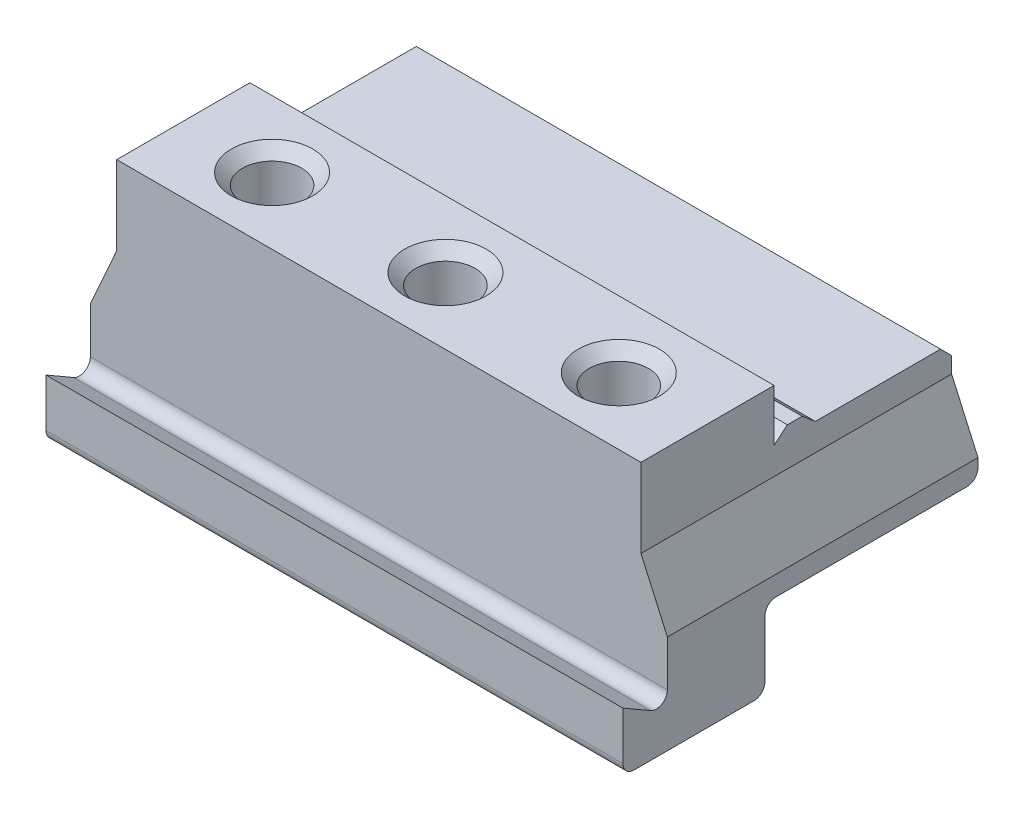
ISO-10303-21;
HEADER;
FILE_DESCRIPTION(('STEP AP214'),'2;1');
FILE_NAME('part.step','',(''),(''),'','','');
FILE_SCHEMA(('AUTOMOTIVE_DESIGN { 1 0 10303 214 1 1 1 1 }'));
ENDSEC;
DATA;
#1=APPLICATION_CONTEXT('core data for automotive mechanical design processes');
#2=APPLICATION_PROTOCOL_DEFINITION('international standard','automotive_design',2000,#1);
#3=PRODUCT_CONTEXT('',#1,'mechanical');
#4=PRODUCT('Part','Part','',(#3));
#5=PRODUCT_RELATED_PRODUCT_CATEGORY('part','',(#4));
#6=PRODUCT_DEFINITION_FORMATION('','',#4);
#7=PRODUCT_DEFINITION_CONTEXT('part definition',#1,'design');
#8=PRODUCT_DEFINITION('design','',#6,#7);
#9=PRODUCT_DEFINITION_SHAPE('','',#8);
#10=(LENGTH_UNIT() NAMED_UNIT(*) SI_UNIT(.MILLI.,.METRE.));
#11=(NAMED_UNIT(*) PLANE_ANGLE_UNIT() SI_UNIT($,.RADIAN.));
#12=(NAMED_UNIT(*) SI_UNIT($,.STERADIAN.) SOLID_ANGLE_UNIT());
#13=UNCERTAINTY_MEASURE_WITH_UNIT(LENGTH_MEASURE(1.E-05),#10,'distance_accuracy_value','');
#14=(GEOMETRIC_REPRESENTATION_CONTEXT(3) GLOBAL_UNCERTAINTY_ASSIGNED_CONTEXT((#13)) GLOBAL_UNIT_ASSIGNED_CONTEXT((#10,
#11,#12)) REPRESENTATION_CONTEXT('',''));
#15=CARTESIAN_POINT('',(0.,0.,0.));
#16=DIRECTION('',(0.,0.,1.));
#17=DIRECTION('',(1.,0.,0.));
#18=AXIS2_PLACEMENT_3D('',#15,#16,#17);
#19=CARTESIAN_POINT('',(78.,32.,0.));
#20=DIRECTION('',(0.,-1.,0.));
#21=DIRECTION('',(0.,0.,-1.));
#22=AXIS2_PLACEMENT_3D('',#19,#20,#21);
#23=PLANE('',#22);
#24=CARTESIAN_POINT('',(62.4381705175318,32.,-15.));
#25=DIRECTION('',(0.,-1.,0.));
#26=DIRECTION('',(0.,0.,-1.));
#27=AXIS2_PLACEMENT_3D('',#24,#25,#26);
#28=CIRCLE('',#27,5.50000000000002);
#29=CARTESIAN_POINT('',(62.4381705175318,32.,-20.5));
#30=VERTEX_POINT('',#29);
#31=EDGE_CURVE('E271',#30,#30,#28,.T.);
#32=ORIENTED_EDGE('',*,*,#31,.T.);
#33=EDGE_LOOP('',(#32));
#34=FACE_BOUND('',#33,.T.);
#35=CARTESIAN_POINT('',(15.5618294824682,32.,-15.));
#36=DIRECTION('',(0.,-1.,0.));
#37=DIRECTION('',(0.,0.,-1.));
#38=AXIS2_PLACEMENT_3D('',#35,#36,#37);
#39=CIRCLE('',#38,5.50000000000002);
#40=CARTESIAN_POINT('',(15.5618294824682,32.,-20.5));
#41=VERTEX_POINT('',#40);
#42=EDGE_CURVE('E268',#41,#41,#39,.T.);
#43=ORIENTED_EDGE('',*,*,#42,.T.);
#44=EDGE_LOOP('',(#43));
#45=FACE_BOUND('',#44,.T.);
#46=CARTESIAN_POINT('',(39.,32.,-15.));
#47=DIRECTION('',(0.,-1.,0.));
#48=DIRECTION('',(0.,0.,-1.));
#49=AXIS2_PLACEMENT_3D('',#46,#47,#48);
#50=CIRCLE('',#49,5.50000000000002);
#51=CARTESIAN_POINT('',(39.,32.,-20.5));
#52=VERTEX_POINT('',#51);
#53=EDGE_CURVE('E270',#52,#52,#50,.T.);
#54=ORIENTED_EDGE('',*,*,#53,.T.);
#55=EDGE_LOOP('',(#54));
#56=FACE_BOUND('',#55,.T.);
#57=DIRECTION('',(0.,0.,1.));
#58=VECTOR('',#57,1.);
#59=CARTESIAN_POINT('',(74.4381705175318,32.,-48.5));
#60=LINE('',#59,#58);
#61=CARTESIAN_POINT('',(74.4381705175318,32.,-24.));
#62=VERTEX_POINT('',#61);
#63=CARTESIAN_POINT('',(74.4381705175318,32.,-6.));
#64=VERTEX_POINT('',#63);
#65=EDGE_CURVE('E197',#62,#64,#60,.T.);
#66=ORIENTED_EDGE('',*,*,#65,.F.);
#67=DIRECTION('',(-1.,0.,0.));
#68=VECTOR('',#67,1.);
#69=CARTESIAN_POINT('',(78.,32.,-24.));
#70=LINE('',#69,#68);
#71=CARTESIAN_POINT('',(3.56182948246823,32.,-24.));
#72=VERTEX_POINT('',#71);
#73=EDGE_CURVE('E219',#62,#72,#70,.T.);
#74=ORIENTED_EDGE('',*,*,#73,.T.);
#75=DIRECTION('',(0.,0.,1.));
#76=VECTOR('',#75,1.);
#77=CARTESIAN_POINT('',(3.56182948246823,32.,-48.5));
#78=LINE('',#77,#76);
#79=CARTESIAN_POINT('',(3.56182948246823,32.,-6.));
#80=VERTEX_POINT('',#79);
#81=EDGE_CURVE('E70',#72,#80,#78,.T.);
#82=ORIENTED_EDGE('',*,*,#81,.T.);
#83=DIRECTION('',(-1.,0.,0.));
#84=VECTOR('',#83,1.);
#85=CARTESIAN_POINT('',(78.,32.,-6.));
#86=LINE('',#85,#84);
#87=EDGE_CURVE('E216',#64,#80,#86,.T.);
#88=ORIENTED_EDGE('',*,*,#87,.F.);
#89=EDGE_LOOP('',(#66,#74,#82,#88));
#90=FACE_BOUND('',#89,.T.);
#91=ADVANCED_FACE('F43',(#34,#45,#56,#90),#23,.F.);
#92=CARTESIAN_POINT('',(78.,0.,-6.));
#93=DIRECTION('',(0.,0.,-1.));
#94=DIRECTION('',(-1.,0.,0.));
#95=AXIS2_PLACEMENT_3D('',#92,#93,#94);
#96=PLANE('',#95);
#97=DIRECTION('',(0.,-1.,0.));
#98=VECTOR('',#97,1.);
#99=CARTESIAN_POINT('',(74.4381705175318,21.33,-6.));
#100=LINE('',#99,#98);
#101=CARTESIAN_POINT('',(74.4381705175318,21.33,-6.));
#102=VERTEX_POINT('',#101);
#103=EDGE_CURVE('E205',#64,#102,#100,.T.);
#104=ORIENTED_EDGE('',*,*,#103,.F.);
#105=ORIENTED_EDGE('',*,*,#87,.T.);
#106=DIRECTION('',(0.,1.,0.));
#107=VECTOR('',#106,1.);
#108=CARTESIAN_POINT('',(3.56182948246823,21.33,-6.));
#109=LINE('',#108,#107);
#110=CARTESIAN_POINT('',(3.56182948246823,21.33,-6.));
#111=VERTEX_POINT('',#110);
#112=EDGE_CURVE('E483',#111,#80,#109,.T.);
#113=ORIENTED_EDGE('',*,*,#112,.F.);
#114=DIRECTION('',(0.406736643075796,0.913545457642603,0.));
#115=VECTOR('',#114,1.);
#116=CARTESIAN_POINT('',(0.,13.33,-6.));
#117=LINE('',#116,#115);
#118=CARTESIAN_POINT('',(0.,13.33,-6.));
#119=VERTEX_POINT('',#118);
#120=EDGE_CURVE('E217',#119,#111,#117,.T.);
#121=ORIENTED_EDGE('',*,*,#120,.F.);
#122=DIRECTION('',(0.,-1.,0.));
#123=VECTOR('',#122,1.);
#124=CARTESIAN_POINT('',(0.,0.,-6.));
#125=LINE('',#124,#123);
#126=CARTESIAN_POINT('',(0.,7.13397459621554,-6.));
#127=VERTEX_POINT('',#126);
#128=EDGE_CURVE('E379',#119,#127,#125,.T.);
#129=ORIENTED_EDGE('',*,*,#128,.T.);
#130=DIRECTION('',(-1.,0.,0.));
#131=VECTOR('',#130,1.);
#132=CARTESIAN_POINT('',(78.,7.13397459621554,-6.));
#133=LINE('',#132,#131);
#134=CARTESIAN_POINT('',(78.,7.13397459621554,-6.));
#135=VERTEX_POINT('',#134);
#136=EDGE_CURVE('E222',#135,#127,#133,.T.);
#137=ORIENTED_EDGE('',*,*,#136,.F.);
#138=DIRECTION('',(0.,-1.,0.));
#139=VECTOR('',#138,1.);
#140=CARTESIAN_POINT('',(78.,0.,-6.));
#141=LINE('',#140,#139);
#142=CARTESIAN_POINT('',(78.,13.33,-6.));
#143=VERTEX_POINT('',#142);
#144=EDGE_CURVE('E467',#143,#135,#141,.T.);
#145=ORIENTED_EDGE('',*,*,#144,.F.);
#146=DIRECTION('',(0.406736643075796,-0.913545457642603,0.));
#147=VECTOR('',#146,1.);
#148=CARTESIAN_POINT('',(78.,13.33,-6.));
#149=LINE('',#148,#147);
#150=EDGE_CURVE('E208',#102,#143,#149,.T.);
#151=ORIENTED_EDGE('',*,*,#150,.F.);
#152=EDGE_LOOP('',(#104,#105,#113,#121,#129,#137,#145,#151));
#153=FACE_BOUND('',#152,.T.);
#154=ADVANCED_FACE('F211',(#153),#96,.F.);
#155=CARTESIAN_POINT('',(78.,0.,0.));
#156=DIRECTION('',(1.,0.,0.));
#157=DIRECTION('',(0.,0.,-1.));
#158=AXIS2_PLACEMENT_3D('',#155,#156,#157);
#159=PLANE('',#158);
#160=DIRECTION('',(0.,1.,0.));
#161=VECTOR('',#160,1.);
#162=CARTESIAN_POINT('',(78.,0.,-48.));
#163=LINE('',#162,#161);
#164=CARTESIAN_POINT('',(78.,12.17,-48.));
#165=VERTEX_POINT('',#164);
#166=CARTESIAN_POINT('',(78.,13.33,-48.));
#167=VERTEX_POINT('',#166);
#168=EDGE_CURVE('E462',#165,#167,#163,.T.);
#169=ORIENTED_EDGE('',*,*,#168,.T.);
#170=DIRECTION('',(0.,0.,1.));
#171=VECTOR('',#170,1.);
#172=CARTESIAN_POINT('',(78.,13.33,-48.5));
#173=LINE('',#172,#171);
#174=EDGE_CURVE('E257',#167,#143,#173,.T.);
#175=ORIENTED_EDGE('',*,*,#174,.T.);
#176=ORIENTED_EDGE('',*,*,#144,.T.);
#177=CARTESIAN_POINT('',(78.,7.13397459621554,-4.5));
#178=DIRECTION('',(1.,0.,0.));
#179=DIRECTION('',(0.,0.,-1.));
#180=AXIS2_PLACEMENT_3D('',#177,#178,#179);
#181=CIRCLE('',#180,1.5);
#182=CARTESIAN_POINT('',(78.,5.83493649053889,-3.74999999999999));
#183=VERTEX_POINT('',#182);
#184=EDGE_CURVE('E444',#135,#183,#181,.F.);
#185=ORIENTED_EDGE('',*,*,#184,.T.);
#186=DIRECTION('',(0.,0.500000000000004,0.866025403784436));
#187=VECTOR('',#186,1.);
#188=CARTESIAN_POINT('',(78.,5.99999999999997,-3.46410161513777));
#189=LINE('',#188,#187);
#190=CARTESIAN_POINT('',(78.,8.,0.));
#191=VERTEX_POINT('',#190);
#192=EDGE_CURVE('E425',#183,#191,#189,.T.);
#193=ORIENTED_EDGE('',*,*,#192,.T.);
#194=DIRECTION('',(0.,-1.,0.));
#195=VECTOR('',#194,1.);
#196=CARTESIAN_POINT('',(78.,0.,0.));
#197=LINE('',#196,#195);
#198=CARTESIAN_POINT('',(78.,1.50000000000001,0.));
#199=VERTEX_POINT('',#198);
#200=EDGE_CURVE('E438',#191,#199,#197,.T.);
#201=ORIENTED_EDGE('',*,*,#200,.T.);
#202=CARTESIAN_POINT('',(78.,1.5,-1.5));
#203=DIRECTION('',(1.,0.,0.));
#204=DIRECTION('',(0.,0.,-1.));
#205=AXIS2_PLACEMENT_3D('',#202,#203,#204);
#206=CIRCLE('',#205,1.5);
#207=CARTESIAN_POINT('',(78.,0.,-1.50000000000001));
#208=VERTEX_POINT('',#207);
#209=EDGE_CURVE('E441',#208,#199,#206,.F.);
#210=ORIENTED_EDGE('',*,*,#209,.F.);
#211=DIRECTION('',(0.,0.,-1.));
#212=VECTOR('',#211,1.);
#213=CARTESIAN_POINT('',(78.,0.,0.));
#214=LINE('',#213,#212);
#215=CARTESIAN_POINT('',(78.,0.,-17.7));
#216=VERTEX_POINT('',#215);
#217=EDGE_CURVE('E442',#208,#216,#214,.T.);
#218=ORIENTED_EDGE('',*,*,#217,.T.);
#219=CARTESIAN_POINT('',(78.,1.5,-17.7));
#220=DIRECTION('',(1.,0.,0.));
#221=DIRECTION('',(0.,0.,-1.));
#222=AXIS2_PLACEMENT_3D('',#219,#220,#221);
#223=CIRCLE('',#222,1.5);
#224=CARTESIAN_POINT('',(78.,1.50000000000001,-19.2));
#225=VERTEX_POINT('',#224);
#226=EDGE_CURVE('E448',#216,#225,#223,.T.);
#227=ORIENTED_EDGE('',*,*,#226,.T.);
#228=DIRECTION('',(0.,1.,0.));
#229=VECTOR('',#228,1.);
#230=CARTESIAN_POINT('',(78.,0.,-19.2));
#231=LINE('',#230,#229);
#232=CARTESIAN_POINT('',(78.,9.16999999999999,-19.2));
#233=VERTEX_POINT('',#232);
#234=EDGE_CURVE('E452',#225,#233,#231,.T.);
#235=ORIENTED_EDGE('',*,*,#234,.T.);
#236=CARTESIAN_POINT('',(78.,9.17,-20.7));
#237=DIRECTION('',(1.,0.,0.));
#238=DIRECTION('',(0.,0.,-1.));
#239=AXIS2_PLACEMENT_3D('',#236,#237,#238);
#240=CIRCLE('',#239,1.5);
#241=CARTESIAN_POINT('',(78.,10.67,-20.7));
#242=VERTEX_POINT('',#241);
#243=EDGE_CURVE('E374',#233,#242,#240,.F.);
#244=ORIENTED_EDGE('',*,*,#243,.T.);
#245=DIRECTION('',(0.,0.,-1.));
#246=VECTOR('',#245,1.);
#247=CARTESIAN_POINT('',(78.,10.67,0.));
#248=LINE('',#247,#246);
#249=CARTESIAN_POINT('',(78.,10.67,-46.5));
#250=VERTEX_POINT('',#249);
#251=EDGE_CURVE('E398',#242,#250,#248,.T.);
#252=ORIENTED_EDGE('',*,*,#251,.T.);
#253=CARTESIAN_POINT('',(78.,12.17,-46.5));
#254=DIRECTION('',(1.,0.,0.));
#255=DIRECTION('',(0.,0.,-1.));
#256=AXIS2_PLACEMENT_3D('',#253,#254,#255);
#257=CIRCLE('',#256,1.5);
#258=EDGE_CURVE('E458',#250,#165,#257,.T.);
#259=ORIENTED_EDGE('',*,*,#258,.T.);
#260=EDGE_LOOP('',(#169,#175,#176,#185,#193,#201,#210,#218,#227,#235,#244,#252,#259));
#261=FACE_BOUND('',#260,.T.);
#262=ADVANCED_FACE('F303',(#261),#159,.T.);
#263=CARTESIAN_POINT('',(0.,0.,0.));
#264=DIRECTION('',(1.,0.,0.));
#265=DIRECTION('',(0.,0.,-1.));
#266=AXIS2_PLACEMENT_3D('',#263,#264,#265);
#267=PLANE('',#266);
#268=DIRECTION('',(0.,0.,1.));
#269=VECTOR('',#268,1.);
#270=CARTESIAN_POINT('',(0.,13.33,-48.5));
#271=LINE('',#270,#269);
#272=CARTESIAN_POINT('',(0.,13.33,-48.));
#273=VERTEX_POINT('',#272);
#274=EDGE_CURVE('E254',#273,#119,#271,.T.);
#275=ORIENTED_EDGE('',*,*,#274,.F.);
#276=DIRECTION('',(0.,1.,0.));
#277=VECTOR('',#276,1.);
#278=CARTESIAN_POINT('',(0.,0.,-48.));
#279=LINE('',#278,#277);
#280=CARTESIAN_POINT('',(0.,12.17,-48.));
#281=VERTEX_POINT('',#280);
#282=EDGE_CURVE('E367',#281,#273,#279,.T.);
#283=ORIENTED_EDGE('',*,*,#282,.F.);
#284=CARTESIAN_POINT('',(0.,12.17,-46.5));
#285=DIRECTION('',(1.,0.,0.));
#286=DIRECTION('',(0.,0.,-1.));
#287=AXIS2_PLACEMENT_3D('',#284,#285,#286);
#288=CIRCLE('',#287,1.5);
#289=CARTESIAN_POINT('',(0.,10.67,-46.5));
#290=VERTEX_POINT('',#289);
#291=EDGE_CURVE('E366',#290,#281,#288,.T.);
#292=ORIENTED_EDGE('',*,*,#291,.F.);
#293=DIRECTION('',(0.,0.,-1.));
#294=VECTOR('',#293,1.);
#295=CARTESIAN_POINT('',(0.,10.67,0.));
#296=LINE('',#295,#294);
#297=CARTESIAN_POINT('',(0.,10.67,-20.7));
#298=VERTEX_POINT('',#297);
#299=EDGE_CURVE('E363',#298,#290,#296,.T.);
#300=ORIENTED_EDGE('',*,*,#299,.F.);
#301=CARTESIAN_POINT('',(0.,9.17,-20.7));
#302=DIRECTION('',(1.,0.,0.));
#303=DIRECTION('',(0.,0.,-1.));
#304=AXIS2_PLACEMENT_3D('',#301,#302,#303);
#305=CIRCLE('',#304,1.5);
#306=CARTESIAN_POINT('',(0.,9.16999999999999,-19.2));
#307=VERTEX_POINT('',#306);
#308=EDGE_CURVE('E399',#307,#298,#305,.F.);
#309=ORIENTED_EDGE('',*,*,#308,.F.);
#310=DIRECTION('',(0.,1.,0.));
#311=VECTOR('',#310,1.);
#312=CARTESIAN_POINT('',(0.,0.,-19.2));
#313=LINE('',#312,#311);
#314=CARTESIAN_POINT('',(0.,1.50000000000001,-19.2));
#315=VERTEX_POINT('',#314);
#316=EDGE_CURVE('E397',#315,#307,#313,.T.);
#317=ORIENTED_EDGE('',*,*,#316,.F.);
#318=CARTESIAN_POINT('',(0.,1.5,-17.7));
#319=DIRECTION('',(1.,0.,0.));
#320=DIRECTION('',(0.,0.,-1.));
#321=AXIS2_PLACEMENT_3D('',#318,#319,#320);
#322=CIRCLE('',#321,1.5);
#323=CARTESIAN_POINT('',(0.,0.,-17.7));
#324=VERTEX_POINT('',#323);
#325=EDGE_CURVE('E393',#324,#315,#322,.T.);
#326=ORIENTED_EDGE('',*,*,#325,.F.);
#327=DIRECTION('',(0.,0.,-1.));
#328=VECTOR('',#327,1.);
#329=CARTESIAN_POINT('',(0.,0.,0.));
#330=LINE('',#329,#328);
#331=CARTESIAN_POINT('',(0.,0.,-1.50000000000001));
#332=VERTEX_POINT('',#331);
#333=EDGE_CURVE('E395',#332,#324,#330,.T.);
#334=ORIENTED_EDGE('',*,*,#333,.F.);
#335=CARTESIAN_POINT('',(0.,1.5,-1.5));
#336=DIRECTION('',(1.,0.,0.));
#337=DIRECTION('',(0.,0.,-1.));
#338=AXIS2_PLACEMENT_3D('',#335,#336,#337);
#339=CIRCLE('',#338,1.5);
#340=CARTESIAN_POINT('',(0.,1.50000000000001,0.));
#341=VERTEX_POINT('',#340);
#342=EDGE_CURVE('E386',#332,#341,#339,.F.);
#343=ORIENTED_EDGE('',*,*,#342,.T.);
#344=DIRECTION('',(0.,-1.,0.));
#345=VECTOR('',#344,1.);
#346=CARTESIAN_POINT('',(0.,0.,0.));
#347=LINE('',#346,#345);
#348=CARTESIAN_POINT('',(0.,8.,0.));
#349=VERTEX_POINT('',#348);
#350=EDGE_CURVE('E387',#349,#341,#347,.T.);
#351=ORIENTED_EDGE('',*,*,#350,.F.);
#352=DIRECTION('',(0.,0.500000000000004,0.866025403784436));
#353=VECTOR('',#352,1.);
#354=CARTESIAN_POINT('',(0.,5.99999999999997,-3.46410161513777));
#355=LINE('',#354,#353);
#356=CARTESIAN_POINT('',(0.,5.83493649053889,-3.74999999999999));
#357=VERTEX_POINT('',#356);
#358=EDGE_CURVE('E381',#357,#349,#355,.T.);
#359=ORIENTED_EDGE('',*,*,#358,.F.);
#360=CARTESIAN_POINT('',(0.,7.13397459621554,-4.5));
#361=DIRECTION('',(1.,0.,0.));
#362=DIRECTION('',(0.,0.,-1.));
#363=AXIS2_PLACEMENT_3D('',#360,#361,#362);
#364=CIRCLE('',#363,1.5);
#365=EDGE_CURVE('E385',#127,#357,#364,.F.);
#366=ORIENTED_EDGE('',*,*,#365,.F.);
#367=ORIENTED_EDGE('',*,*,#128,.F.);
#368=EDGE_LOOP('',(#275,#283,#292,#300,#309,#317,#326,#334,#343,#351,#359,#366,#367));
#369=FACE_BOUND('',#368,.T.);
#370=ADVANCED_FACE('F344',(#369),#267,.F.);
#371=CARTESIAN_POINT('',(78.,10.67,0.));
#372=DIRECTION('',(0.,1.,0.));
#373=DIRECTION('',(0.,0.,1.));
#374=AXIS2_PLACEMENT_3D('',#371,#372,#373);
#375=PLANE('',#374);
#376=ORIENTED_EDGE('',*,*,#299,.T.);
#377=DIRECTION('',(-1.,0.,0.));
#378=VECTOR('',#377,1.);
#379=CARTESIAN_POINT('',(78.,10.67,-46.5));
#380=LINE('',#379,#378);
#381=EDGE_CURVE('E249',#250,#290,#380,.T.);
#382=ORIENTED_EDGE('',*,*,#381,.F.);
#383=ORIENTED_EDGE('',*,*,#251,.F.);
#384=DIRECTION('',(-1.,0.,0.));
#385=VECTOR('',#384,1.);
#386=CARTESIAN_POINT('',(78.,10.67,-20.7));
#387=LINE('',#386,#385);
#388=EDGE_CURVE('E364',#242,#298,#387,.T.);
#389=ORIENTED_EDGE('',*,*,#388,.T.);
#390=EDGE_LOOP('',(#376,#382,#383,#389));
#391=FACE_BOUND('',#390,.T.);
#392=ADVANCED_FACE('F338',(#391),#375,.F.);
#393=CARTESIAN_POINT('',(78.,12.17,-46.5));
#394=DIRECTION('',(-1.,0.,0.));
#395=DIRECTION('',(0.,0.,1.));
#396=AXIS2_PLACEMENT_3D('',#393,#394,#395);
#397=CYLINDRICAL_SURFACE('',#396,1.5);
#398=ORIENTED_EDGE('',*,*,#291,.T.);
#399=DIRECTION('',(-1.,0.,0.));
#400=VECTOR('',#399,1.);
#401=CARTESIAN_POINT('',(78.,12.17,-48.));
#402=LINE('',#401,#400);
#403=EDGE_CURVE('E250',#165,#281,#402,.T.);
#404=ORIENTED_EDGE('',*,*,#403,.F.);
#405=ORIENTED_EDGE('',*,*,#258,.F.);
#406=ORIENTED_EDGE('',*,*,#381,.T.);
#407=EDGE_LOOP('',(#398,#404,#405,#406));
#408=FACE_BOUND('',#407,.T.);
#409=ADVANCED_FACE('F337',(#408),#397,.T.);
#410=CARTESIAN_POINT('',(78.,0.,-48.));
#411=DIRECTION('',(0.,0.,1.));
#412=DIRECTION('',(1.,0.,0.));
#413=AXIS2_PLACEMENT_3D('',#410,#411,#412);
#414=PLANE('',#413);
#415=DIRECTION('',(0.,-1.,0.));
#416=VECTOR('',#415,1.);
#417=CARTESIAN_POINT('',(74.4381705175318,0.,-48.));
#418=LINE('',#417,#416);
#419=CARTESIAN_POINT('',(74.4381705175318,23.5,-48.));
#420=VERTEX_POINT('',#419);
#421=CARTESIAN_POINT('',(74.4381705175318,21.33,-48.));
#422=VERTEX_POINT('',#421);
#423=EDGE_CURVE('E370',#420,#422,#418,.T.);
#424=ORIENTED_EDGE('',*,*,#423,.T.);
#425=DIRECTION('',(0.406736643075796,-0.913545457642603,0.));
#426=VECTOR('',#425,1.);
#427=CARTESIAN_POINT('',(82.9530602618068,2.20524450861817,-48.));
#428=LINE('',#427,#426);
#429=EDGE_CURVE('E261',#422,#167,#428,.T.);
#430=ORIENTED_EDGE('',*,*,#429,.T.);
#431=ORIENTED_EDGE('',*,*,#168,.F.);
#432=ORIENTED_EDGE('',*,*,#403,.T.);
#433=ORIENTED_EDGE('',*,*,#282,.T.);
#434=DIRECTION('',(0.406736643075796,0.913545457642603,0.));
#435=VECTOR('',#434,1.);
#436=CARTESIAN_POINT('',(7.95084609019747,31.1878927022363,-48.));
#437=LINE('',#436,#435);
#438=CARTESIAN_POINT('',(3.56182948246823,21.33,-48.));
#439=VERTEX_POINT('',#438);
#440=EDGE_CURVE('E259',#273,#439,#437,.T.);
#441=ORIENTED_EDGE('',*,*,#440,.T.);
#442=DIRECTION('',(0.,1.,0.));
#443=VECTOR('',#442,1.);
#444=CARTESIAN_POINT('',(3.56182948246823,0.,-48.));
#445=LINE('',#444,#443);
#446=CARTESIAN_POINT('',(3.56182948246823,23.5,-48.));
#447=VERTEX_POINT('',#446);
#448=EDGE_CURVE('E502',#439,#447,#445,.T.);
#449=ORIENTED_EDGE('',*,*,#448,.T.);
#450=DIRECTION('',(-1.,0.,0.));
#451=VECTOR('',#450,1.);
#452=CARTESIAN_POINT('',(78.,23.5,-48.));
#453=LINE('',#452,#451);
#454=EDGE_CURVE('E242',#420,#447,#453,.T.);
#455=ORIENTED_EDGE('',*,*,#454,.F.);
#456=EDGE_LOOP('',(#424,#430,#431,#432,#433,#441,#449,#455));
#457=FACE_BOUND('',#456,.T.);
#458=ADVANCED_FACE('F335',(#457),#414,.F.);
#459=CARTESIAN_POINT('',(78.,35.7499999999999,-35.7500000000001));
#460=DIRECTION('',(0.,-0.707106781186546,0.707106781186549));
#461=DIRECTION('',(0.,-0.707106781186549,-0.707106781186546));
#462=AXIS2_PLACEMENT_3D('',#459,#460,#461);
#463=PLANE('',#462);
#464=DIRECTION('',(-1.,0.,0.));
#465=VECTOR('',#464,1.);
#466=CARTESIAN_POINT('',(78.,25.,-46.5));
#467=LINE('',#466,#465);
#468=CARTESIAN_POINT('',(74.4381705175318,25.,-46.5));
#469=VERTEX_POINT('',#468);
#470=CARTESIAN_POINT('',(3.56182948246823,25.,-46.5));
#471=VERTEX_POINT('',#470);
#472=EDGE_CURVE('E241',#469,#471,#467,.T.);
#473=ORIENTED_EDGE('',*,*,#472,.F.);
#474=DIRECTION('',(0.,-0.707106781186549,-0.707106781186546));
#475=VECTOR('',#474,1.);
#476=CARTESIAN_POINT('',(74.4381705175318,35.7499999999999,-35.7500000000001));
#477=LINE('',#476,#475);
#478=EDGE_CURVE('E375',#469,#420,#477,.T.);
#479=ORIENTED_EDGE('',*,*,#478,.T.);
#480=ORIENTED_EDGE('',*,*,#454,.T.);
#481=DIRECTION('',(0.,0.707106781186549,0.707106781186546));
#482=VECTOR('',#481,1.);
#483=CARTESIAN_POINT('',(3.56182948246823,35.7499999999999,-35.7500000000001));
#484=LINE('',#483,#482);
#485=EDGE_CURVE('E501',#447,#471,#484,.T.);
#486=ORIENTED_EDGE('',*,*,#485,.T.);
#487=EDGE_LOOP('',(#473,#479,#480,#486));
#488=FACE_BOUND('',#487,.T.);
#489=ADVANCED_FACE('F327',(#488),#463,.F.);
#490=CARTESIAN_POINT('',(78.,25.,0.));
#491=DIRECTION('',(0.,-1.,0.));
#492=DIRECTION('',(0.,0.,-1.));
#493=AXIS2_PLACEMENT_3D('',#490,#491,#492);
#494=PLANE('',#493);
#495=DIRECTION('',(-1.,0.,0.));
#496=VECTOR('',#495,1.);
#497=CARTESIAN_POINT('',(78.,25.,-29.5752607777826));
#498=LINE('',#497,#496);
#499=CARTESIAN_POINT('',(74.4381705175318,25.,-29.5752607777826));
#500=VERTEX_POINT('',#499);
#501=CARTESIAN_POINT('',(3.56182948246823,25.,-29.5752607777826));
#502=VERTEX_POINT('',#501);
#503=EDGE_CURVE('E238',#500,#502,#498,.T.);
#504=ORIENTED_EDGE('',*,*,#503,.F.);
#505=DIRECTION('',(0.,0.,-1.));
#506=VECTOR('',#505,1.);
#507=CARTESIAN_POINT('',(74.4381705175318,25.,0.));
#508=LINE('',#507,#506);
#509=EDGE_CURVE('E514',#500,#469,#508,.T.);
#510=ORIENTED_EDGE('',*,*,#509,.T.);
#511=ORIENTED_EDGE('',*,*,#472,.T.);
#512=DIRECTION('',(0.,0.,1.));
#513=VECTOR('',#512,1.);
#514=CARTESIAN_POINT('',(3.56182948246823,25.,0.));
#515=LINE('',#514,#513);
#516=EDGE_CURVE('E498',#471,#502,#515,.T.);
#517=ORIENTED_EDGE('',*,*,#516,.T.);
#518=EDGE_LOOP('',(#504,#510,#511,#517));
#519=FACE_BOUND('',#518,.T.);
#520=ADVANCED_FACE('F321',(#519),#494,.F.);
#521=CARTESIAN_POINT('',(78.,29.2335752764957,-24.5298822325009));
#522=DIRECTION('',(0.,-0.766044443118977,0.642787609686541));
#523=DIRECTION('',(0.,-0.642787609686541,-0.766044443118977));
#524=AXIS2_PLACEMENT_3D('',#521,#522,#523);
#525=PLANE('',#524);
#526=DIRECTION('',(-1.,0.,0.));
#527=VECTOR('',#526,1.);
#528=CARTESIAN_POINT('',(78.,26.5,-27.7876303888913));
#529=LINE('',#528,#527);
#530=CARTESIAN_POINT('',(74.4381705175318,26.5,-27.7876303888913));
#531=VERTEX_POINT('',#530);
#532=CARTESIAN_POINT('',(3.56182948246823,26.5,-27.7876303888913));
#533=VERTEX_POINT('',#532);
#534=EDGE_CURVE('E232',#531,#533,#529,.T.);
#535=ORIENTED_EDGE('',*,*,#534,.F.);
#536=DIRECTION('',(0.,-0.642787609686541,-0.766044443118977));
#537=VECTOR('',#536,1.);
#538=CARTESIAN_POINT('',(74.4381705175318,29.2335752764957,-24.5298822325009));
#539=LINE('',#538,#537);
#540=EDGE_CURVE('E509',#531,#500,#539,.T.);
#541=ORIENTED_EDGE('',*,*,#540,.T.);
#542=ORIENTED_EDGE('',*,*,#503,.T.);
#543=DIRECTION('',(0.,0.642787609686541,0.766044443118977));
#544=VECTOR('',#543,1.);
#545=CARTESIAN_POINT('',(3.56182948246823,29.2335752764957,-24.5298822325009));
#546=LINE('',#545,#544);
#547=EDGE_CURVE('E492',#502,#533,#546,.T.);
#548=ORIENTED_EDGE('',*,*,#547,.T.);
#549=EDGE_LOOP('',(#535,#541,#542,#548));
#550=FACE_BOUND('',#549,.T.);
#551=ADVANCED_FACE('F318',(#550),#525,.F.);
#552=CARTESIAN_POINT('',(78.,26.5,0.));
#553=DIRECTION('',(0.,-1.,0.));
#554=DIRECTION('',(0.,0.,-1.));
#555=AXIS2_PLACEMENT_3D('',#552,#553,#554);
#556=PLANE('',#555);
#557=DIRECTION('',(-1.,0.,0.));
#558=VECTOR('',#557,1.);
#559=CARTESIAN_POINT('',(78.,26.5,-25.7876303888913));
#560=LINE('',#559,#558);
#561=CARTESIAN_POINT('',(74.4381705175318,26.5,-25.7876303888913));
#562=VERTEX_POINT('',#561);
#563=CARTESIAN_POINT('',(3.56182948246823,26.5,-25.7876303888913));
#564=VERTEX_POINT('',#563);
#565=EDGE_CURVE('E235',#562,#564,#560,.T.);
#566=ORIENTED_EDGE('',*,*,#565,.F.);
#567=DIRECTION('',(0.,0.,-1.));
#568=VECTOR('',#567,1.);
#569=CARTESIAN_POINT('',(74.4381705175318,26.5,0.));
#570=LINE('',#569,#568);
#571=EDGE_CURVE('E510',#562,#531,#570,.T.);
#572=ORIENTED_EDGE('',*,*,#571,.T.);
#573=ORIENTED_EDGE('',*,*,#534,.T.);
#574=DIRECTION('',(0.,0.,1.));
#575=VECTOR('',#574,1.);
#576=CARTESIAN_POINT('',(3.56182948246823,26.5,0.));
#577=LINE('',#576,#575);
#578=EDGE_CURVE('E495',#533,#564,#577,.T.);
#579=ORIENTED_EDGE('',*,*,#578,.T.);
#580=EDGE_LOOP('',(#566,#572,#573,#579));
#581=FACE_BOUND('',#580,.T.);
#582=ADVANCED_FACE('F317',(#581),#556,.F.);
#583=CARTESIAN_POINT('',(78.,2.85290918469003,2.39387504465569));
#584=DIRECTION('',(0.,-0.766044443118976,-0.642787609686542));
#585=DIRECTION('',(0.,0.642787609686542,-0.766044443118976));
#586=AXIS2_PLACEMENT_3D('',#583,#584,#585);
#587=PLANE('',#586);
#588=DIRECTION('',(-1.,0.,0.));
#589=VECTOR('',#588,1.);
#590=CARTESIAN_POINT('',(78.,25.,-24.));
#591=LINE('',#590,#589);
#592=CARTESIAN_POINT('',(74.4381705175318,25.,-24.));
#593=VERTEX_POINT('',#592);
#594=CARTESIAN_POINT('',(3.56182948246823,25.,-24.));
#595=VERTEX_POINT('',#594);
#596=EDGE_CURVE('E224',#593,#595,#591,.T.);
#597=ORIENTED_EDGE('',*,*,#596,.F.);
#598=DIRECTION('',(0.,0.642787609686542,-0.766044443118976));
#599=VECTOR('',#598,1.);
#600=CARTESIAN_POINT('',(74.4381705175318,2.85290918469003,2.39387504465569));
#601=LINE('',#600,#599);
#602=EDGE_CURVE('E56',#593,#562,#601,.T.);
#603=ORIENTED_EDGE('',*,*,#602,.T.);
#604=ORIENTED_EDGE('',*,*,#565,.T.);
#605=DIRECTION('',(0.,-0.642787609686542,0.766044443118976));
#606=VECTOR('',#605,1.);
#607=CARTESIAN_POINT('',(3.56182948246823,2.85290918469003,2.39387504465569));
#608=LINE('',#607,#606);
#609=EDGE_CURVE('E482',#564,#595,#608,.T.);
#610=ORIENTED_EDGE('',*,*,#609,.T.);
#611=EDGE_LOOP('',(#597,#603,#604,#610));
#612=FACE_BOUND('',#611,.T.);
#613=ADVANCED_FACE('F315',(#612),#587,.F.);
#614=CARTESIAN_POINT('',(78.,0.,-24.));
#615=DIRECTION('',(0.,0.,1.));
#616=DIRECTION('',(1.,0.,0.));
#617=AXIS2_PLACEMENT_3D('',#614,#615,#616);
#618=PLANE('',#617);
#619=ORIENTED_EDGE('',*,*,#73,.F.);
#620=DIRECTION('',(0.,-1.,0.));
#621=VECTOR('',#620,1.);
#622=CARTESIAN_POINT('',(74.4381705175318,0.,-24.));
#623=LINE('',#622,#621);
#624=EDGE_CURVE('E201',#62,#593,#623,.T.);
#625=ORIENTED_EDGE('',*,*,#624,.T.);
#626=ORIENTED_EDGE('',*,*,#596,.T.);
#627=DIRECTION('',(0.,1.,0.));
#628=VECTOR('',#627,1.);
#629=CARTESIAN_POINT('',(3.56182948246823,0.,-24.));
#630=LINE('',#629,#628);
#631=EDGE_CURVE('E251',#595,#72,#630,.T.);
#632=ORIENTED_EDGE('',*,*,#631,.T.);
#633=EDGE_LOOP('',(#619,#625,#626,#632));
#634=FACE_BOUND('',#633,.T.);
#635=ADVANCED_FACE('F308',(#634),#618,.F.);
#636=CARTESIAN_POINT('',(78.,7.13397459621554,-4.5));
#637=DIRECTION('',(-1.,0.,0.));
#638=DIRECTION('',(0.,0.,1.));
#639=AXIS2_PLACEMENT_3D('',#636,#637,#638);
#640=CYLINDRICAL_SURFACE('',#639,1.5);
#641=ORIENTED_EDGE('',*,*,#365,.T.);
#642=DIRECTION('',(-1.,0.,0.));
#643=VECTOR('',#642,1.);
#644=CARTESIAN_POINT('',(78.,5.83493649053889,-3.74999999999999));
#645=LINE('',#644,#643);
#646=EDGE_CURVE('E228',#183,#357,#645,.T.);
#647=ORIENTED_EDGE('',*,*,#646,.F.);
#648=ORIENTED_EDGE('',*,*,#184,.F.);
#649=ORIENTED_EDGE('',*,*,#136,.T.);
#650=EDGE_LOOP('',(#641,#647,#648,#649));
#651=FACE_BOUND('',#650,.T.);
#652=ADVANCED_FACE('F311',(#651),#640,.F.);
#653=CARTESIAN_POINT('',(78.,5.99999999999997,-3.46410161513777));
#654=DIRECTION('',(0.,-0.866025403784436,0.500000000000004));
#655=DIRECTION('',(0.,-0.500000000000004,-0.866025403784436));
#656=AXIS2_PLACEMENT_3D('',#653,#654,#655);
#657=PLANE('',#656);
#658=ORIENTED_EDGE('',*,*,#358,.T.);
#659=DIRECTION('',(-1.,0.,0.));
#660=VECTOR('',#659,1.);
#661=CARTESIAN_POINT('',(78.,8.,0.));
#662=LINE('',#661,#660);
#663=EDGE_CURVE('E414',#191,#349,#662,.T.);
#664=ORIENTED_EDGE('',*,*,#663,.F.);
#665=ORIENTED_EDGE('',*,*,#192,.F.);
#666=ORIENTED_EDGE('',*,*,#646,.T.);
#667=EDGE_LOOP('',(#658,#664,#665,#666));
#668=FACE_BOUND('',#667,.T.);
#669=ADVANCED_FACE('F422',(#668),#657,.F.);
#670=CARTESIAN_POINT('',(78.,0.,0.));
#671=DIRECTION('',(0.,0.,-1.));
#672=DIRECTION('',(0.,1.,0.));
#673=AXIS2_PLACEMENT_3D('',#670,#671,#672);
#674=PLANE('',#673);
#675=ORIENTED_EDGE('',*,*,#350,.T.);
#676=DIRECTION('',(-1.,0.,0.));
#677=VECTOR('',#676,1.);
#678=CARTESIAN_POINT('',(78.,1.50000000000001,0.));
#679=LINE('',#678,#677);
#680=EDGE_CURVE('E412',#199,#341,#679,.T.);
#681=ORIENTED_EDGE('',*,*,#680,.F.);
#682=ORIENTED_EDGE('',*,*,#200,.F.);
#683=ORIENTED_EDGE('',*,*,#663,.T.);
#684=EDGE_LOOP('',(#675,#681,#682,#683));
#685=FACE_BOUND('',#684,.T.);
#686=ADVANCED_FACE('F434',(#685),#674,.F.);
#687=CARTESIAN_POINT('',(78.,1.5,-1.5));
#688=DIRECTION('',(-1.,0.,0.));
#689=DIRECTION('',(0.,0.,1.));
#690=AXIS2_PLACEMENT_3D('',#687,#688,#689);
#691=CYLINDRICAL_SURFACE('',#690,1.5);
#692=ORIENTED_EDGE('',*,*,#342,.F.);
#693=DIRECTION('',(-1.,0.,0.));
#694=VECTOR('',#693,1.);
#695=CARTESIAN_POINT('',(78.,0.,-1.50000000000001));
#696=LINE('',#695,#694);
#697=EDGE_CURVE('E411',#208,#332,#696,.T.);
#698=ORIENTED_EDGE('',*,*,#697,.F.);
#699=ORIENTED_EDGE('',*,*,#209,.T.);
#700=ORIENTED_EDGE('',*,*,#680,.T.);
#701=EDGE_LOOP('',(#692,#698,#699,#700));
#702=FACE_BOUND('',#701,.T.);
#703=ADVANCED_FACE('F547',(#702),#691,.T.);
#704=CARTESIAN_POINT('',(78.,0.,0.));
#705=DIRECTION('',(0.,1.,0.));
#706=DIRECTION('',(0.,0.,1.));
#707=AXIS2_PLACEMENT_3D('',#704,#705,#706);
#708=PLANE('',#707);
#709=ORIENTED_EDGE('',*,*,#333,.T.);
#710=DIRECTION('',(-1.,0.,0.));
#711=VECTOR('',#710,1.);
#712=CARTESIAN_POINT('',(78.,0.,-17.7));
#713=LINE('',#712,#711);
#714=EDGE_CURVE('E409',#216,#324,#713,.T.);
#715=ORIENTED_EDGE('',*,*,#714,.F.);
#716=ORIENTED_EDGE('',*,*,#217,.F.);
#717=ORIENTED_EDGE('',*,*,#697,.T.);
#718=EDGE_LOOP('',(#709,#715,#716,#717));
#719=FACE_BOUND('',#718,.T.);
#720=ADVANCED_FACE('F545',(#719),#708,.F.);
#721=CARTESIAN_POINT('',(78.,1.5,-17.7));
#722=DIRECTION('',(-1.,0.,0.));
#723=DIRECTION('',(0.,0.,1.));
#724=AXIS2_PLACEMENT_3D('',#721,#722,#723);
#725=CYLINDRICAL_SURFACE('',#724,1.5);
#726=ORIENTED_EDGE('',*,*,#325,.T.);
#727=DIRECTION('',(-1.,0.,0.));
#728=VECTOR('',#727,1.);
#729=CARTESIAN_POINT('',(78.,1.50000000000001,-19.2));
#730=LINE('',#729,#728);
#731=EDGE_CURVE('E403',#225,#315,#730,.T.);
#732=ORIENTED_EDGE('',*,*,#731,.F.);
#733=ORIENTED_EDGE('',*,*,#226,.F.);
#734=ORIENTED_EDGE('',*,*,#714,.T.);
#735=EDGE_LOOP('',(#726,#732,#733,#734));
#736=FACE_BOUND('',#735,.T.);
#737=ADVANCED_FACE('F539',(#736),#725,.T.);
#738=CARTESIAN_POINT('',(78.,0.,-19.2));
#739=DIRECTION('',(0.,0.,1.));
#740=DIRECTION('',(1.,0.,0.));
#741=AXIS2_PLACEMENT_3D('',#738,#739,#740);
#742=PLANE('',#741);
#743=ORIENTED_EDGE('',*,*,#316,.T.);
#744=DIRECTION('',(-1.,0.,0.));
#745=VECTOR('',#744,1.);
#746=CARTESIAN_POINT('',(78.,9.16999999999999,-19.2));
#747=LINE('',#746,#745);
#748=EDGE_CURVE('E405',#233,#307,#747,.T.);
#749=ORIENTED_EDGE('',*,*,#748,.F.);
#750=ORIENTED_EDGE('',*,*,#234,.F.);
#751=ORIENTED_EDGE('',*,*,#731,.T.);
#752=EDGE_LOOP('',(#743,#749,#750,#751));
#753=FACE_BOUND('',#752,.T.);
#754=ADVANCED_FACE('F526',(#753),#742,.F.);
#755=CARTESIAN_POINT('',(78.,9.17,-20.7));
#756=DIRECTION('',(-1.,0.,0.));
#757=DIRECTION('',(0.,0.,1.));
#758=AXIS2_PLACEMENT_3D('',#755,#756,#757);
#759=CYLINDRICAL_SURFACE('',#758,1.5);
#760=ORIENTED_EDGE('',*,*,#308,.T.);
#761=ORIENTED_EDGE('',*,*,#388,.F.);
#762=ORIENTED_EDGE('',*,*,#243,.F.);
#763=ORIENTED_EDGE('',*,*,#748,.T.);
#764=EDGE_LOOP('',(#760,#761,#762,#763));
#765=FACE_BOUND('',#764,.T.);
#766=ADVANCED_FACE('F457',(#765),#759,.F.);
#767=CARTESIAN_POINT('',(0.,13.33,-48.5));
#768=DIRECTION('',(0.913545457642603,-0.406736643075796,0.));
#769=DIRECTION('',(0.406736643075796,0.913545457642603,0.));
#770=AXIS2_PLACEMENT_3D('',#767,#768,#769);
#771=PLANE('',#770);
#772=ORIENTED_EDGE('',*,*,#274,.T.);
#773=ORIENTED_EDGE('',*,*,#120,.T.);
#774=DIRECTION('',(0.,0.,1.));
#775=VECTOR('',#774,1.);
#776=CARTESIAN_POINT('',(3.56182948246823,21.33,-48.5));
#777=LINE('',#776,#775);
#778=EDGE_CURVE('E484',#439,#111,#777,.T.);
#779=ORIENTED_EDGE('',*,*,#778,.F.);
#780=ORIENTED_EDGE('',*,*,#440,.F.);
#781=EDGE_LOOP('',(#772,#773,#779,#780));
#782=FACE_BOUND('',#781,.T.);
#783=ADVANCED_FACE('F518',(#782),#771,.F.);
#784=CARTESIAN_POINT('',(3.56182948246823,21.33,-48.5));
#785=DIRECTION('',(1.,0.,0.));
#786=DIRECTION('',(0.,0.,-1.));
#787=AXIS2_PLACEMENT_3D('',#784,#785,#786);
#788=PLANE('',#787);
#789=ORIENTED_EDGE('',*,*,#778,.T.);
#790=ORIENTED_EDGE('',*,*,#112,.T.);
#791=ORIENTED_EDGE('',*,*,#81,.F.);
#792=ORIENTED_EDGE('',*,*,#631,.F.);
#793=ORIENTED_EDGE('',*,*,#609,.F.);
#794=ORIENTED_EDGE('',*,*,#578,.F.);
#795=ORIENTED_EDGE('',*,*,#547,.F.);
#796=ORIENTED_EDGE('',*,*,#516,.F.);
#797=ORIENTED_EDGE('',*,*,#485,.F.);
#798=ORIENTED_EDGE('',*,*,#448,.F.);
#799=EDGE_LOOP('',(#789,#790,#791,#792,#793,#794,#795,#796,#797,#798));
#800=FACE_BOUND('',#799,.T.);
#801=ADVANCED_FACE('F516',(#800),#788,.F.);
#802=CARTESIAN_POINT('',(78.,13.33,-48.5));
#803=DIRECTION('',(-0.913545457642603,-0.406736643075796,0.));
#804=DIRECTION('',(0.406736643075796,-0.913545457642603,0.));
#805=AXIS2_PLACEMENT_3D('',#802,#803,#804);
#806=PLANE('',#805);
#807=DIRECTION('',(0.,0.,1.));
#808=VECTOR('',#807,1.);
#809=CARTESIAN_POINT('',(74.4381705175318,21.33,-48.5));
#810=LINE('',#809,#808);
#811=EDGE_CURVE('E209',#422,#102,#810,.T.);
#812=ORIENTED_EDGE('',*,*,#811,.T.);
#813=ORIENTED_EDGE('',*,*,#150,.T.);
#814=ORIENTED_EDGE('',*,*,#174,.F.);
#815=ORIENTED_EDGE('',*,*,#429,.F.);
#816=EDGE_LOOP('',(#812,#813,#814,#815));
#817=FACE_BOUND('',#816,.T.);
#818=ADVANCED_FACE('F527',(#817),#806,.F.);
#819=CARTESIAN_POINT('',(74.4381705175318,21.33,-48.5));
#820=DIRECTION('',(-1.,0.,0.));
#821=DIRECTION('',(0.,0.,1.));
#822=AXIS2_PLACEMENT_3D('',#819,#820,#821);
#823=PLANE('',#822);
#824=ORIENTED_EDGE('',*,*,#478,.F.);
#825=ORIENTED_EDGE('',*,*,#509,.F.);
#826=ORIENTED_EDGE('',*,*,#540,.F.);
#827=ORIENTED_EDGE('',*,*,#571,.F.);
#828=ORIENTED_EDGE('',*,*,#602,.F.);
#829=ORIENTED_EDGE('',*,*,#624,.F.);
#830=ORIENTED_EDGE('',*,*,#65,.T.);
#831=ORIENTED_EDGE('',*,*,#103,.T.);
#832=ORIENTED_EDGE('',*,*,#811,.F.);
#833=ORIENTED_EDGE('',*,*,#423,.F.);
#834=EDGE_LOOP('',(#824,#825,#826,#827,#828,#829,#830,#831,#832,#833));
#835=FACE_BOUND('',#834,.T.);
#836=ADVANCED_FACE('F199',(#835),#823,.F.);
#837=CARTESIAN_POINT('',(15.5618294824682,22.,-15.));
#838=DIRECTION('',(0.,1.,0.));
#839=DIRECTION('',(0.,0.,1.));
#840=AXIS2_PLACEMENT_3D('',#837,#838,#839);
#841=CYLINDRICAL_SURFACE('',#840,4.00000000000001);
#842=CARTESIAN_POINT('',(15.5618294824682,30.5,-15.));
#843=DIRECTION('',(0.,-1.,0.));
#844=DIRECTION('',(0.,0.,-1.));
#845=AXIS2_PLACEMENT_3D('',#842,#843,#844);
#846=CIRCLE('',#845,4.00000000000001);
#847=CARTESIAN_POINT('',(15.5618294824682,30.5,-19.));
#848=VERTEX_POINT('',#847);
#849=EDGE_CURVE('E55',#848,#848,#846,.F.);
#850=ORIENTED_EDGE('',*,*,#849,.T.);
#851=EDGE_LOOP('',(#850));
#852=FACE_BOUND('',#851,.T.);
#853=CARTESIAN_POINT('',(15.5618294824682,22.,-15.));
#854=DIRECTION('',(0.,1.,0.));
#855=DIRECTION('',(0.,0.,-1.));
#856=AXIS2_PLACEMENT_3D('',#853,#854,#855);
#857=CIRCLE('',#856,4.00000000000001);
#858=CARTESIAN_POINT('',(15.5618294824682,22.,-19.));
#859=VERTEX_POINT('',#858);
#860=EDGE_CURVE('E779',#859,#859,#857,.T.);
#861=ORIENTED_EDGE('',*,*,#860,.F.);
#862=EDGE_LOOP('',(#861));
#863=FACE_BOUND('',#862,.T.);
#864=ADVANCED_FACE('F279',(#852,#863),#841,.F.);
#865=CARTESIAN_POINT('',(15.5618294824682,22.,-15.));
#866=DIRECTION('',(0.,-1.,0.));
#867=DIRECTION('',(0.,0.,-1.));
#868=AXIS2_PLACEMENT_3D('',#865,#866,#867);
#869=PLANE('',#868);
#870=ORIENTED_EDGE('',*,*,#860,.T.);
#871=EDGE_LOOP('',(#870));
#872=FACE_BOUND('',#871,.T.);
#873=ADVANCED_FACE('F705',(#872),#869,.F.);
#874=CARTESIAN_POINT('',(39.,22.,-15.));
#875=DIRECTION('',(0.,1.,0.));
#876=DIRECTION('',(0.,0.,1.));
#877=AXIS2_PLACEMENT_3D('',#874,#875,#876);
#878=CYLINDRICAL_SURFACE('',#877,4.);
#879=CARTESIAN_POINT('',(39.,30.5,-15.));
#880=DIRECTION('',(0.,-1.,0.));
#881=DIRECTION('',(0.,0.,-1.));
#882=AXIS2_PLACEMENT_3D('',#879,#880,#881);
#883=CIRCLE('',#882,4.);
#884=CARTESIAN_POINT('',(39.,30.5,-19.));
#885=VERTEX_POINT('',#884);
#886=EDGE_CURVE('E11',#885,#885,#883,.F.);
#887=ORIENTED_EDGE('',*,*,#886,.T.);
#888=EDGE_LOOP('',(#887));
#889=FACE_BOUND('',#888,.T.);
#890=CARTESIAN_POINT('',(39.,22.,-15.));
#891=DIRECTION('',(0.,1.,0.));
#892=DIRECTION('',(0.,0.,1.));
#893=AXIS2_PLACEMENT_3D('',#890,#891,#892);
#894=CIRCLE('',#893,4.);
#895=CARTESIAN_POINT('',(39.,22.,-11.));
#896=VERTEX_POINT('',#895);
#897=EDGE_CURVE('E773',#896,#896,#894,.T.);
#898=ORIENTED_EDGE('',*,*,#897,.F.);
#899=EDGE_LOOP('',(#898));
#900=FACE_BOUND('',#899,.T.);
#901=ADVANCED_FACE('F708',(#889,#900),#878,.F.);
#902=CARTESIAN_POINT('',(39.,22.,-15.));
#903=DIRECTION('',(0.,1.,0.));
#904=DIRECTION('',(0.,0.,1.));
#905=AXIS2_PLACEMENT_3D('',#902,#903,#904);
#906=PLANE('',#905);
#907=ORIENTED_EDGE('',*,*,#897,.T.);
#908=EDGE_LOOP('',(#907));
#909=FACE_BOUND('',#908,.T.);
#910=ADVANCED_FACE('F718',(#909),#906,.T.);
#911=CARTESIAN_POINT('',(62.4381705175318,22.,-15.));
#912=DIRECTION('',(0.,1.,0.));
#913=DIRECTION('',(0.,0.,1.));
#914=AXIS2_PLACEMENT_3D('',#911,#912,#913);
#915=CYLINDRICAL_SURFACE('',#914,4.00000000000001);
#916=CARTESIAN_POINT('',(62.4381705175318,30.5,-15.));
#917=DIRECTION('',(0.,-1.,0.));
#918=DIRECTION('',(0.,0.,-1.));
#919=AXIS2_PLACEMENT_3D('',#916,#917,#918);
#920=CIRCLE('',#919,4.00000000000001);
#921=CARTESIAN_POINT('',(62.4381705175318,30.5,-19.));
#922=VERTEX_POINT('',#921);
#923=EDGE_CURVE('E263',#922,#922,#920,.F.);
#924=ORIENTED_EDGE('',*,*,#923,.T.);
#925=EDGE_LOOP('',(#924));
#926=FACE_BOUND('',#925,.T.);
#927=CARTESIAN_POINT('',(62.4381705175318,22.,-15.));
#928=DIRECTION('',(0.,1.,0.));
#929=DIRECTION('',(0.,0.,1.));
#930=AXIS2_PLACEMENT_3D('',#927,#928,#929);
#931=CIRCLE('',#930,4.00000000000001);
#932=CARTESIAN_POINT('',(62.4381705175318,22.,-11.));
#933=VERTEX_POINT('',#932);
#934=EDGE_CURVE('E488',#933,#933,#931,.T.);
#935=ORIENTED_EDGE('',*,*,#934,.F.);
#936=EDGE_LOOP('',(#935));
#937=FACE_BOUND('',#936,.T.);
#938=ADVANCED_FACE('F726',(#926,#937),#915,.F.);
#939=CARTESIAN_POINT('',(62.4381705175318,22.,-15.));
#940=DIRECTION('',(0.,1.,0.));
#941=DIRECTION('',(0.,0.,1.));
#942=AXIS2_PLACEMENT_3D('',#939,#940,#941);
#943=PLANE('',#942);
#944=ORIENTED_EDGE('',*,*,#934,.T.);
#945=EDGE_LOOP('',(#944));
#946=FACE_BOUND('',#945,.T.);
#947=ADVANCED_FACE('F288',(#946),#943,.T.);
#948=CARTESIAN_POINT('',(62.4381705175318,30.5,-15.));
#949=DIRECTION('',(0.,1.,0.));
#950=DIRECTION('',(0.,0.,1.));
#951=AXIS2_PLACEMENT_3D('',#948,#949,#950);
#952=CONICAL_SURFACE('',#951,4.00000000000001,0.785398163397449);
#953=ORIENTED_EDGE('',*,*,#31,.F.);
#954=EDGE_LOOP('',(#953));
#955=FACE_BOUND('',#954,.T.);
#956=ORIENTED_EDGE('',*,*,#923,.F.);
#957=EDGE_LOOP('',(#956));
#958=FACE_BOUND('',#957,.T.);
#959=ADVANCED_FACE('F282',(#955,#958),#952,.F.);
#960=CARTESIAN_POINT('',(15.5618294824682,30.5,-15.));
#961=DIRECTION('',(0.,1.,0.));
#962=DIRECTION('',(0.,0.,1.));
#963=AXIS2_PLACEMENT_3D('',#960,#961,#962);
#964=CONICAL_SURFACE('',#963,4.00000000000001,0.785398163397449);
#965=ORIENTED_EDGE('',*,*,#42,.F.);
#966=EDGE_LOOP('',(#965));
#967=FACE_BOUND('',#966,.T.);
#968=ORIENTED_EDGE('',*,*,#849,.F.);
#969=EDGE_LOOP('',(#968));
#970=FACE_BOUND('',#969,.T.);
#971=ADVANCED_FACE('F281',(#967,#970),#964,.F.);
#972=CARTESIAN_POINT('',(39.,30.5,-15.));
#973=DIRECTION('',(0.,1.,0.));
#974=DIRECTION('',(0.,0.,1.));
#975=AXIS2_PLACEMENT_3D('',#972,#973,#974);
#976=CONICAL_SURFACE('',#975,4.,0.78539816339745);
#977=ORIENTED_EDGE('',*,*,#53,.F.);
#978=EDGE_LOOP('',(#977));
#979=FACE_BOUND('',#978,.T.);
#980=ORIENTED_EDGE('',*,*,#886,.F.);
#981=EDGE_LOOP('',(#980));
#982=FACE_BOUND('',#981,.T.);
#983=ADVANCED_FACE('F46',(#979,#982),#976,.F.);
#984=CLOSED_SHELL('',(#91,#154,#262,#370,#392,#409,#458,#489,#520,#551,#582,#613,#635,#652,#669,
#686,#703,#720,#737,#754,#766,#783,#801,#818,#836,#864,#873,#901,#910,#938,#947,#959,#971,#983));
#985=MANIFOLD_SOLID_BREP('B2',#984);
#986=ADVANCED_BREP_SHAPE_REPRESENTATION('',(#18,#985),#14);
#987=SHAPE_DEFINITION_REPRESENTATION(#9,#986);
ENDSEC;
END-ISO-10303-21;
